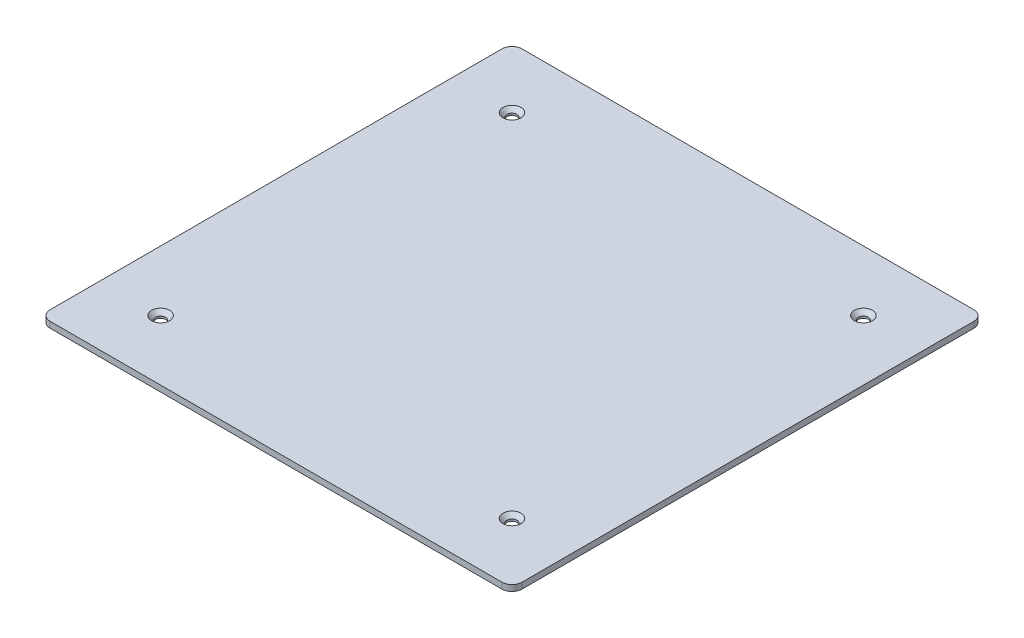
ISO-10303-21;
HEADER;
FILE_DESCRIPTION(('STEP AP214'),'2;1');
FILE_NAME('part.step','',(''),(''),'','','');
FILE_SCHEMA(('AUTOMOTIVE_DESIGN { 1 0 10303 214 1 1 1 1 }'));
ENDSEC;
DATA;
#1=APPLICATION_CONTEXT('core data for automotive mechanical design processes');
#2=APPLICATION_PROTOCOL_DEFINITION('international standard','automotive_design',2000,#1);
#3=PRODUCT_CONTEXT('',#1,'mechanical');
#4=PRODUCT('Part','Part','',(#3));
#5=PRODUCT_RELATED_PRODUCT_CATEGORY('part','',(#4));
#6=PRODUCT_DEFINITION_FORMATION('','',#4);
#7=PRODUCT_DEFINITION_CONTEXT('part definition',#1,'design');
#8=PRODUCT_DEFINITION('design','',#6,#7);
#9=PRODUCT_DEFINITION_SHAPE('','',#8);
#10=(LENGTH_UNIT() NAMED_UNIT(*) SI_UNIT(.MILLI.,.METRE.));
#11=(NAMED_UNIT(*) PLANE_ANGLE_UNIT() SI_UNIT($,.RADIAN.));
#12=(NAMED_UNIT(*) SI_UNIT($,.STERADIAN.) SOLID_ANGLE_UNIT());
#13=UNCERTAINTY_MEASURE_WITH_UNIT(LENGTH_MEASURE(1.E-05),#10,'distance_accuracy_value','');
#14=(GEOMETRIC_REPRESENTATION_CONTEXT(3) GLOBAL_UNCERTAINTY_ASSIGNED_CONTEXT((#13)) GLOBAL_UNIT_ASSIGNED_CONTEXT((#10,
#11,#12)) REPRESENTATION_CONTEXT('',''));
#15=CARTESIAN_POINT('',(0.,0.,0.));
#16=DIRECTION('',(0.,0.,1.));
#17=DIRECTION('',(1.,0.,0.));
#18=AXIS2_PLACEMENT_3D('',#15,#16,#17);
#19=CARTESIAN_POINT('',(112.5,3.,112.5));
#20=DIRECTION('',(0.,1.,0.));
#21=DIRECTION('',(0.,0.,1.));
#22=AXIS2_PLACEMENT_3D('',#19,#20,#21);
#23=PLANE('',#22);
#24=CARTESIAN_POINT('',(87.5,3.,-87.5));
#25=DIRECTION('',(0.,1.,0.));
#26=DIRECTION('',(0.,0.,1.));
#27=AXIS2_PLACEMENT_3D('',#24,#25,#26);
#28=CIRCLE('',#27,4.50000000000003);
#29=CARTESIAN_POINT('',(87.5,3.,-83.));
#30=VERTEX_POINT('',#29);
#31=EDGE_CURVE('E172',#30,#30,#28,.F.);
#32=ORIENTED_EDGE('',*,*,#31,.T.);
#33=EDGE_LOOP('',(#32));
#34=FACE_BOUND('',#33,.T.);
#35=CARTESIAN_POINT('',(87.5,3.,87.5));
#36=DIRECTION('',(0.,1.,0.));
#37=DIRECTION('',(0.,0.,1.));
#38=AXIS2_PLACEMENT_3D('',#35,#36,#37);
#39=CIRCLE('',#38,4.50000000000002);
#40=CARTESIAN_POINT('',(87.5,3.,92.));
#41=VERTEX_POINT('',#40);
#42=EDGE_CURVE('E169',#41,#41,#39,.F.);
#43=ORIENTED_EDGE('',*,*,#42,.T.);
#44=EDGE_LOOP('',(#43));
#45=FACE_BOUND('',#44,.T.);
#46=CARTESIAN_POINT('',(-87.5,3.,87.5));
#47=DIRECTION('',(0.,1.,0.));
#48=DIRECTION('',(0.,0.,1.));
#49=AXIS2_PLACEMENT_3D('',#46,#47,#48);
#50=CIRCLE('',#49,4.50000000000002);
#51=CARTESIAN_POINT('',(-87.5,3.,92.0000000000001));
#52=VERTEX_POINT('',#51);
#53=EDGE_CURVE('E166',#52,#52,#50,.F.);
#54=ORIENTED_EDGE('',*,*,#53,.T.);
#55=EDGE_LOOP('',(#54));
#56=FACE_BOUND('',#55,.T.);
#57=CARTESIAN_POINT('',(-87.5,3.,-87.5));
#58=DIRECTION('',(0.,1.,0.));
#59=DIRECTION('',(0.,0.,1.));
#60=AXIS2_PLACEMENT_3D('',#57,#58,#59);
#61=CIRCLE('',#60,4.50000000000003);
#62=CARTESIAN_POINT('',(-87.5,3.,-83.));
#63=VERTEX_POINT('',#62);
#64=EDGE_CURVE('E163',#63,#63,#61,.F.);
#65=ORIENTED_EDGE('',*,*,#64,.T.);
#66=EDGE_LOOP('',(#65));
#67=FACE_BOUND('',#66,.T.);
#68=CARTESIAN_POINT('',(112.5,3.,112.5));
#69=DIRECTION('',(0.,1.,0.));
#70=DIRECTION('',(0.,0.,1.));
#71=AXIS2_PLACEMENT_3D('',#68,#69,#70);
#72=CIRCLE('',#71,5.);
#73=CARTESIAN_POINT('',(112.5,3.,117.5));
#74=VERTEX_POINT('',#73);
#75=CARTESIAN_POINT('',(117.5,3.,112.5));
#76=VERTEX_POINT('',#75);
#77=EDGE_CURVE('E145',#74,#76,#72,.T.);
#78=ORIENTED_EDGE('',*,*,#77,.T.);
#79=DIRECTION('',(0.,0.,-1.));
#80=VECTOR('',#79,1.);
#81=CARTESIAN_POINT('',(117.5,3.,112.5));
#82=LINE('',#81,#80);
#83=CARTESIAN_POINT('',(117.5,3.,-112.5));
#84=VERTEX_POINT('',#83);
#85=EDGE_CURVE('E94',#76,#84,#82,.T.);
#86=ORIENTED_EDGE('',*,*,#85,.T.);
#87=CARTESIAN_POINT('',(112.5,3.,-112.5));
#88=DIRECTION('',(0.,1.,0.));
#89=DIRECTION('',(0.,0.,1.));
#90=AXIS2_PLACEMENT_3D('',#87,#88,#89);
#91=CIRCLE('',#90,5.);
#92=CARTESIAN_POINT('',(112.5,3.,-117.5));
#93=VERTEX_POINT('',#92);
#94=EDGE_CURVE('E268',#84,#93,#91,.T.);
#95=ORIENTED_EDGE('',*,*,#94,.T.);
#96=DIRECTION('',(-1.,0.,0.));
#97=VECTOR('',#96,1.);
#98=CARTESIAN_POINT('',(112.5,3.,-117.5));
#99=LINE('',#98,#97);
#100=CARTESIAN_POINT('',(-112.5,3.,-117.5));
#101=VERTEX_POINT('',#100);
#102=EDGE_CURVE('E270',#93,#101,#99,.T.);
#103=ORIENTED_EDGE('',*,*,#102,.T.);
#104=CARTESIAN_POINT('',(-112.5,3.,-112.5));
#105=DIRECTION('',(0.,1.,0.));
#106=DIRECTION('',(0.,0.,1.));
#107=AXIS2_PLACEMENT_3D('',#104,#105,#106);
#108=CIRCLE('',#107,5.);
#109=CARTESIAN_POINT('',(-117.5,3.,-112.5));
#110=VERTEX_POINT('',#109);
#111=EDGE_CURVE('E112',#101,#110,#108,.T.);
#112=ORIENTED_EDGE('',*,*,#111,.T.);
#113=DIRECTION('',(0.,0.,1.));
#114=VECTOR('',#113,1.);
#115=CARTESIAN_POINT('',(-117.5,3.,112.5));
#116=LINE('',#115,#114);
#117=CARTESIAN_POINT('',(-117.5,3.,112.5));
#118=VERTEX_POINT('',#117);
#119=EDGE_CURVE('E107',#110,#118,#116,.T.);
#120=ORIENTED_EDGE('',*,*,#119,.T.);
#121=CARTESIAN_POINT('',(-112.5,3.,112.5));
#122=DIRECTION('',(0.,1.,0.));
#123=DIRECTION('',(0.,0.,-1.));
#124=AXIS2_PLACEMENT_3D('',#121,#122,#123);
#125=CIRCLE('',#124,5.);
#126=CARTESIAN_POINT('',(-112.5,3.,117.5));
#127=VERTEX_POINT('',#126);
#128=EDGE_CURVE('E110',#118,#127,#125,.T.);
#129=ORIENTED_EDGE('',*,*,#128,.T.);
#130=DIRECTION('',(1.,0.,0.));
#131=VECTOR('',#130,1.);
#132=CARTESIAN_POINT('',(112.5,3.,117.5));
#133=LINE('',#132,#131);
#134=EDGE_CURVE('E50',#127,#74,#133,.T.);
#135=ORIENTED_EDGE('',*,*,#134,.T.);
#136=EDGE_LOOP('',(#78,#86,#95,#103,#112,#120,#129,#135));
#137=FACE_BOUND('',#136,.T.);
#138=ADVANCED_FACE('F33',(#34,#45,#56,#67,#137),#23,.T.);
#139=CARTESIAN_POINT('',(112.5,0.,112.5));
#140=DIRECTION('',(0.,1.,0.));
#141=DIRECTION('',(0.,0.,1.));
#142=AXIS2_PLACEMENT_3D('',#139,#140,#141);
#143=PLANE('',#142);
#144=CARTESIAN_POINT('',(112.5,0.,112.5));
#145=DIRECTION('',(0.,1.,0.));
#146=DIRECTION('',(0.,0.,1.));
#147=AXIS2_PLACEMENT_3D('',#144,#145,#146);
#148=CIRCLE('',#147,5.);
#149=CARTESIAN_POINT('',(112.5,0.,117.5));
#150=VERTEX_POINT('',#149);
#151=CARTESIAN_POINT('',(117.5,0.,112.5));
#152=VERTEX_POINT('',#151);
#153=EDGE_CURVE('E130',#150,#152,#148,.T.);
#154=ORIENTED_EDGE('',*,*,#153,.F.);
#155=DIRECTION('',(1.,0.,0.));
#156=VECTOR('',#155,1.);
#157=CARTESIAN_POINT('',(112.5,0.,117.5));
#158=LINE('',#157,#156);
#159=CARTESIAN_POINT('',(-112.5,0.,117.5));
#160=VERTEX_POINT('',#159);
#161=EDGE_CURVE('E85',#160,#150,#158,.T.);
#162=ORIENTED_EDGE('',*,*,#161,.F.);
#163=CARTESIAN_POINT('',(-112.5,0.,112.5));
#164=DIRECTION('',(0.,1.,0.));
#165=DIRECTION('',(0.,0.,-1.));
#166=AXIS2_PLACEMENT_3D('',#163,#164,#165);
#167=CIRCLE('',#166,5.);
#168=CARTESIAN_POINT('',(-117.5,0.,112.5));
#169=VERTEX_POINT('',#168);
#170=EDGE_CURVE('E79',#169,#160,#167,.T.);
#171=ORIENTED_EDGE('',*,*,#170,.F.);
#172=DIRECTION('',(0.,0.,1.));
#173=VECTOR('',#172,1.);
#174=CARTESIAN_POINT('',(-117.5,0.,112.5));
#175=LINE('',#174,#173);
#176=CARTESIAN_POINT('',(-117.5,0.,-112.5));
#177=VERTEX_POINT('',#176);
#178=EDGE_CURVE('E120',#177,#169,#175,.T.);
#179=ORIENTED_EDGE('',*,*,#178,.F.);
#180=CARTESIAN_POINT('',(-112.5,0.,-112.5));
#181=DIRECTION('',(0.,1.,0.));
#182=DIRECTION('',(0.,0.,1.));
#183=AXIS2_PLACEMENT_3D('',#180,#181,#182);
#184=CIRCLE('',#183,5.);
#185=CARTESIAN_POINT('',(-112.5,0.,-117.5));
#186=VERTEX_POINT('',#185);
#187=EDGE_CURVE('E140',#186,#177,#184,.T.);
#188=ORIENTED_EDGE('',*,*,#187,.F.);
#189=DIRECTION('',(-1.,0.,0.));
#190=VECTOR('',#189,1.);
#191=CARTESIAN_POINT('',(112.5,0.,-117.5));
#192=LINE('',#191,#190);
#193=CARTESIAN_POINT('',(112.5,0.,-117.5));
#194=VERTEX_POINT('',#193);
#195=EDGE_CURVE('E138',#194,#186,#192,.T.);
#196=ORIENTED_EDGE('',*,*,#195,.F.);
#197=CARTESIAN_POINT('',(112.5,0.,-112.5));
#198=DIRECTION('',(0.,1.,0.));
#199=DIRECTION('',(0.,0.,1.));
#200=AXIS2_PLACEMENT_3D('',#197,#198,#199);
#201=CIRCLE('',#200,5.);
#202=CARTESIAN_POINT('',(117.5,0.,-112.5));
#203=VERTEX_POINT('',#202);
#204=EDGE_CURVE('E136',#203,#194,#201,.T.);
#205=ORIENTED_EDGE('',*,*,#204,.F.);
#206=DIRECTION('',(0.,0.,-1.));
#207=VECTOR('',#206,1.);
#208=CARTESIAN_POINT('',(117.5,0.,112.5));
#209=LINE('',#208,#207);
#210=EDGE_CURVE('E133',#152,#203,#209,.T.);
#211=ORIENTED_EDGE('',*,*,#210,.F.);
#212=EDGE_LOOP('',(#154,#162,#171,#179,#188,#196,#205,#211));
#213=FACE_BOUND('',#212,.T.);
#214=CARTESIAN_POINT('',(-87.5,0.,-87.5));
#215=DIRECTION('',(0.,1.,0.));
#216=DIRECTION('',(0.,0.,1.));
#217=AXIS2_PLACEMENT_3D('',#214,#215,#216);
#218=CIRCLE('',#217,2.5);
#219=CARTESIAN_POINT('',(-87.5,0.,-85.));
#220=VERTEX_POINT('',#219);
#221=EDGE_CURVE('E134',#220,#220,#218,.T.);
#222=ORIENTED_EDGE('',*,*,#221,.T.);
#223=EDGE_LOOP('',(#222));
#224=FACE_BOUND('',#223,.T.);
#225=CARTESIAN_POINT('',(-87.5,0.,87.5));
#226=DIRECTION('',(0.,1.,0.));
#227=DIRECTION('',(0.,0.,1.));
#228=AXIS2_PLACEMENT_3D('',#225,#226,#227);
#229=CIRCLE('',#228,2.5);
#230=CARTESIAN_POINT('',(-87.5,0.,90.));
#231=VERTEX_POINT('',#230);
#232=EDGE_CURVE('E259',#231,#231,#229,.T.);
#233=ORIENTED_EDGE('',*,*,#232,.T.);
#234=EDGE_LOOP('',(#233));
#235=FACE_BOUND('',#234,.T.);
#236=CARTESIAN_POINT('',(87.5,0.,87.5));
#237=DIRECTION('',(0.,1.,0.));
#238=DIRECTION('',(0.,0.,1.));
#239=AXIS2_PLACEMENT_3D('',#236,#237,#238);
#240=CIRCLE('',#239,2.5);
#241=CARTESIAN_POINT('',(87.5,0.,90.));
#242=VERTEX_POINT('',#241);
#243=EDGE_CURVE('E256',#242,#242,#240,.T.);
#244=ORIENTED_EDGE('',*,*,#243,.T.);
#245=EDGE_LOOP('',(#244));
#246=FACE_BOUND('',#245,.T.);
#247=CARTESIAN_POINT('',(87.5,0.,-87.5));
#248=DIRECTION('',(0.,1.,0.));
#249=DIRECTION('',(0.,0.,1.));
#250=AXIS2_PLACEMENT_3D('',#247,#248,#249);
#251=CIRCLE('',#250,2.5);
#252=CARTESIAN_POINT('',(87.5,0.,-85.));
#253=VERTEX_POINT('',#252);
#254=EDGE_CURVE('E254',#253,#253,#251,.T.);
#255=ORIENTED_EDGE('',*,*,#254,.T.);
#256=EDGE_LOOP('',(#255));
#257=FACE_BOUND('',#256,.T.);
#258=ADVANCED_FACE('F197',(#213,#224,#235,#246,#257),#143,.F.);
#259=CARTESIAN_POINT('',(112.5,3.,112.5));
#260=DIRECTION('',(0.,-1.,0.));
#261=DIRECTION('',(0.,0.,-1.));
#262=AXIS2_PLACEMENT_3D('',#259,#260,#261);
#263=CYLINDRICAL_SURFACE('',#262,5.);
#264=ORIENTED_EDGE('',*,*,#153,.T.);
#265=DIRECTION('',(0.,-1.,0.));
#266=VECTOR('',#265,1.);
#267=CARTESIAN_POINT('',(117.5,3.,112.5));
#268=LINE('',#267,#266);
#269=EDGE_CURVE('E158',#76,#152,#268,.T.);
#270=ORIENTED_EDGE('',*,*,#269,.F.);
#271=ORIENTED_EDGE('',*,*,#77,.F.);
#272=DIRECTION('',(0.,-1.,0.));
#273=VECTOR('',#272,1.);
#274=CARTESIAN_POINT('',(112.5,3.,117.5));
#275=LINE('',#274,#273);
#276=EDGE_CURVE('E126',#74,#150,#275,.T.);
#277=ORIENTED_EDGE('',*,*,#276,.T.);
#278=EDGE_LOOP('',(#264,#270,#271,#277));
#279=FACE_BOUND('',#278,.T.);
#280=ADVANCED_FACE('F205',(#279),#263,.T.);
#281=CARTESIAN_POINT('',(117.5,3.,112.5));
#282=DIRECTION('',(-1.,0.,0.));
#283=DIRECTION('',(0.,0.,1.));
#284=AXIS2_PLACEMENT_3D('',#281,#282,#283);
#285=PLANE('',#284);
#286=ORIENTED_EDGE('',*,*,#210,.T.);
#287=DIRECTION('',(0.,-1.,0.));
#288=VECTOR('',#287,1.);
#289=CARTESIAN_POINT('',(117.5,3.,-112.5));
#290=LINE('',#289,#288);
#291=EDGE_CURVE('E155',#84,#203,#290,.T.);
#292=ORIENTED_EDGE('',*,*,#291,.F.);
#293=ORIENTED_EDGE('',*,*,#85,.F.);
#294=ORIENTED_EDGE('',*,*,#269,.T.);
#295=EDGE_LOOP('',(#286,#292,#293,#294));
#296=FACE_BOUND('',#295,.T.);
#297=ADVANCED_FACE('F231',(#296),#285,.F.);
#298=CARTESIAN_POINT('',(112.5,3.,-112.5));
#299=DIRECTION('',(0.,-1.,0.));
#300=DIRECTION('',(0.,0.,-1.));
#301=AXIS2_PLACEMENT_3D('',#298,#299,#300);
#302=CYLINDRICAL_SURFACE('',#301,5.);
#303=ORIENTED_EDGE('',*,*,#204,.T.);
#304=DIRECTION('',(0.,-1.,0.));
#305=VECTOR('',#304,1.);
#306=CARTESIAN_POINT('',(112.5,3.,-117.5));
#307=LINE('',#306,#305);
#308=EDGE_CURVE('E152',#93,#194,#307,.T.);
#309=ORIENTED_EDGE('',*,*,#308,.F.);
#310=ORIENTED_EDGE('',*,*,#94,.F.);
#311=ORIENTED_EDGE('',*,*,#291,.T.);
#312=EDGE_LOOP('',(#303,#309,#310,#311));
#313=FACE_BOUND('',#312,.T.);
#314=ADVANCED_FACE('F227',(#313),#302,.T.);
#315=CARTESIAN_POINT('',(112.5,3.,-117.5));
#316=DIRECTION('',(0.,0.,1.));
#317=DIRECTION('',(1.,0.,0.));
#318=AXIS2_PLACEMENT_3D('',#315,#316,#317);
#319=PLANE('',#318);
#320=ORIENTED_EDGE('',*,*,#195,.T.);
#321=DIRECTION('',(0.,-1.,0.));
#322=VECTOR('',#321,1.);
#323=CARTESIAN_POINT('',(-112.5,3.,-117.5));
#324=LINE('',#323,#322);
#325=EDGE_CURVE('E149',#101,#186,#324,.T.);
#326=ORIENTED_EDGE('',*,*,#325,.F.);
#327=ORIENTED_EDGE('',*,*,#102,.F.);
#328=ORIENTED_EDGE('',*,*,#308,.T.);
#329=EDGE_LOOP('',(#320,#326,#327,#328));
#330=FACE_BOUND('',#329,.T.);
#331=ADVANCED_FACE('F223',(#330),#319,.F.);
#332=CARTESIAN_POINT('',(-112.5,3.,-112.5));
#333=DIRECTION('',(0.,-1.,0.));
#334=DIRECTION('',(0.,0.,-1.));
#335=AXIS2_PLACEMENT_3D('',#332,#333,#334);
#336=CYLINDRICAL_SURFACE('',#335,5.);
#337=ORIENTED_EDGE('',*,*,#187,.T.);
#338=DIRECTION('',(0.,-1.,0.));
#339=VECTOR('',#338,1.);
#340=CARTESIAN_POINT('',(-117.5,3.,-112.5));
#341=LINE('',#340,#339);
#342=EDGE_CURVE('E121',#110,#177,#341,.T.);
#343=ORIENTED_EDGE('',*,*,#342,.F.);
#344=ORIENTED_EDGE('',*,*,#111,.F.);
#345=ORIENTED_EDGE('',*,*,#325,.T.);
#346=EDGE_LOOP('',(#337,#343,#344,#345));
#347=FACE_BOUND('',#346,.T.);
#348=ADVANCED_FACE('F220',(#347),#336,.T.);
#349=CARTESIAN_POINT('',(-117.5,3.,112.5));
#350=DIRECTION('',(1.,0.,0.));
#351=DIRECTION('',(0.,0.,-1.));
#352=AXIS2_PLACEMENT_3D('',#349,#350,#351);
#353=PLANE('',#352);
#354=ORIENTED_EDGE('',*,*,#178,.T.);
#355=DIRECTION('',(0.,-1.,0.));
#356=VECTOR('',#355,1.);
#357=CARTESIAN_POINT('',(-117.5,3.,112.5));
#358=LINE('',#357,#356);
#359=EDGE_CURVE('E117',#118,#169,#358,.T.);
#360=ORIENTED_EDGE('',*,*,#359,.F.);
#361=ORIENTED_EDGE('',*,*,#119,.F.);
#362=ORIENTED_EDGE('',*,*,#342,.T.);
#363=EDGE_LOOP('',(#354,#360,#361,#362));
#364=FACE_BOUND('',#363,.T.);
#365=ADVANCED_FACE('F118',(#364),#353,.F.);
#366=CARTESIAN_POINT('',(-112.5,3.,112.5));
#367=DIRECTION('',(0.,-1.,0.));
#368=DIRECTION('',(0.,0.,-1.));
#369=AXIS2_PLACEMENT_3D('',#366,#367,#368);
#370=CYLINDRICAL_SURFACE('',#369,5.);
#371=ORIENTED_EDGE('',*,*,#170,.T.);
#372=DIRECTION('',(0.,-1.,0.));
#373=VECTOR('',#372,1.);
#374=CARTESIAN_POINT('',(-112.5,3.,117.5));
#375=LINE('',#374,#373);
#376=EDGE_CURVE('E122',#127,#160,#375,.T.);
#377=ORIENTED_EDGE('',*,*,#376,.F.);
#378=ORIENTED_EDGE('',*,*,#128,.F.);
#379=ORIENTED_EDGE('',*,*,#359,.T.);
#380=EDGE_LOOP('',(#371,#377,#378,#379));
#381=FACE_BOUND('',#380,.T.);
#382=ADVANCED_FACE('F124',(#381),#370,.T.);
#383=CARTESIAN_POINT('',(112.5,3.,117.5));
#384=DIRECTION('',(0.,0.,-1.));
#385=DIRECTION('',(-1.,0.,0.));
#386=AXIS2_PLACEMENT_3D('',#383,#384,#385);
#387=PLANE('',#386);
#388=ORIENTED_EDGE('',*,*,#161,.T.);
#389=ORIENTED_EDGE('',*,*,#276,.F.);
#390=ORIENTED_EDGE('',*,*,#134,.F.);
#391=ORIENTED_EDGE('',*,*,#376,.T.);
#392=EDGE_LOOP('',(#388,#389,#390,#391));
#393=FACE_BOUND('',#392,.T.);
#394=ADVANCED_FACE('F213',(#393),#387,.F.);
#395=CARTESIAN_POINT('',(-87.5,3.,-87.5));
#396=DIRECTION('',(0.,-1.,0.));
#397=DIRECTION('',(0.,0.,-1.));
#398=AXIS2_PLACEMENT_3D('',#395,#396,#397);
#399=CYLINDRICAL_SURFACE('',#398,2.5);
#400=CARTESIAN_POINT('',(-87.5,0.999999999999983,-87.5));
#401=DIRECTION('',(0.,1.,0.));
#402=DIRECTION('',(0.,0.,1.));
#403=AXIS2_PLACEMENT_3D('',#400,#401,#402);
#404=CIRCLE('',#403,2.5);
#405=CARTESIAN_POINT('',(-87.5,0.999999999999983,-85.));
#406=VERTEX_POINT('',#405);
#407=EDGE_CURVE('E11',#406,#406,#404,.T.);
#408=ORIENTED_EDGE('',*,*,#407,.T.);
#409=EDGE_LOOP('',(#408));
#410=FACE_BOUND('',#409,.T.);
#411=ORIENTED_EDGE('',*,*,#221,.F.);
#412=EDGE_LOOP('',(#411));
#413=FACE_BOUND('',#412,.T.);
#414=ADVANCED_FACE('F210',(#410,#413),#399,.F.);
#415=CARTESIAN_POINT('',(-87.5,3.,87.5));
#416=DIRECTION('',(0.,-1.,0.));
#417=DIRECTION('',(0.,0.,-1.));
#418=AXIS2_PLACEMENT_3D('',#415,#416,#417);
#419=CYLINDRICAL_SURFACE('',#418,2.5);
#420=CARTESIAN_POINT('',(-87.5,0.999999999999983,87.5));
#421=DIRECTION('',(0.,1.,0.));
#422=DIRECTION('',(0.,0.,1.));
#423=AXIS2_PLACEMENT_3D('',#420,#421,#422);
#424=CIRCLE('',#423,2.5);
#425=CARTESIAN_POINT('',(-87.5,0.999999999999983,90.));
#426=VERTEX_POINT('',#425);
#427=EDGE_CURVE('E42',#426,#426,#424,.T.);
#428=ORIENTED_EDGE('',*,*,#427,.T.);
#429=EDGE_LOOP('',(#428));
#430=FACE_BOUND('',#429,.T.);
#431=ORIENTED_EDGE('',*,*,#232,.F.);
#432=EDGE_LOOP('',(#431));
#433=FACE_BOUND('',#432,.T.);
#434=ADVANCED_FACE('F180',(#430,#433),#419,.F.);
#435=CARTESIAN_POINT('',(87.5,3.,87.5));
#436=DIRECTION('',(0.,-1.,0.));
#437=DIRECTION('',(0.,0.,-1.));
#438=AXIS2_PLACEMENT_3D('',#435,#436,#437);
#439=CYLINDRICAL_SURFACE('',#438,2.5);
#440=CARTESIAN_POINT('',(87.5,0.999999999999983,87.5));
#441=DIRECTION('',(0.,1.,0.));
#442=DIRECTION('',(0.,0.,1.));
#443=AXIS2_PLACEMENT_3D('',#440,#441,#442);
#444=CIRCLE('',#443,2.5);
#445=CARTESIAN_POINT('',(87.5,0.999999999999983,90.));
#446=VERTEX_POINT('',#445);
#447=EDGE_CURVE('E175',#446,#446,#444,.T.);
#448=ORIENTED_EDGE('',*,*,#447,.T.);
#449=EDGE_LOOP('',(#448));
#450=FACE_BOUND('',#449,.T.);
#451=ORIENTED_EDGE('',*,*,#243,.F.);
#452=EDGE_LOOP('',(#451));
#453=FACE_BOUND('',#452,.T.);
#454=ADVANCED_FACE('F245',(#450,#453),#439,.F.);
#455=CARTESIAN_POINT('',(87.5,3.,-87.5));
#456=DIRECTION('',(0.,-1.,0.));
#457=DIRECTION('',(0.,0.,-1.));
#458=AXIS2_PLACEMENT_3D('',#455,#456,#457);
#459=CYLINDRICAL_SURFACE('',#458,2.5);
#460=CARTESIAN_POINT('',(87.5,0.999999999999983,-87.5));
#461=DIRECTION('',(0.,1.,0.));
#462=DIRECTION('',(0.,0.,1.));
#463=AXIS2_PLACEMENT_3D('',#460,#461,#462);
#464=CIRCLE('',#463,2.5);
#465=CARTESIAN_POINT('',(87.5,0.999999999999983,-85.));
#466=VERTEX_POINT('',#465);
#467=EDGE_CURVE('E160',#466,#466,#464,.T.);
#468=ORIENTED_EDGE('',*,*,#467,.T.);
#469=EDGE_LOOP('',(#468));
#470=FACE_BOUND('',#469,.T.);
#471=ORIENTED_EDGE('',*,*,#254,.F.);
#472=EDGE_LOOP('',(#471));
#473=FACE_BOUND('',#472,.T.);
#474=ADVANCED_FACE('F239',(#470,#473),#459,.F.);
#475=CARTESIAN_POINT('',(87.5,0.999999999999983,-87.5));
#476=DIRECTION('',(0.,1.,0.));
#477=DIRECTION('',(0.,0.,1.));
#478=AXIS2_PLACEMENT_3D('',#475,#476,#477);
#479=CONICAL_SURFACE('',#478,2.5,0.785398163397453);
#480=ORIENTED_EDGE('',*,*,#31,.F.);
#481=EDGE_LOOP('',(#480));
#482=FACE_BOUND('',#481,.T.);
#483=ORIENTED_EDGE('',*,*,#467,.F.);
#484=EDGE_LOOP('',(#483));
#485=FACE_BOUND('',#484,.T.);
#486=ADVANCED_FACE('F192',(#482,#485),#479,.F.);
#487=CARTESIAN_POINT('',(87.5,0.999999999999983,87.5));
#488=DIRECTION('',(0.,1.,0.));
#489=DIRECTION('',(0.,0.,1.));
#490=AXIS2_PLACEMENT_3D('',#487,#488,#489);
#491=CONICAL_SURFACE('',#490,2.5,0.78539816339745);
#492=ORIENTED_EDGE('',*,*,#42,.F.);
#493=EDGE_LOOP('',(#492));
#494=FACE_BOUND('',#493,.T.);
#495=ORIENTED_EDGE('',*,*,#447,.F.);
#496=EDGE_LOOP('',(#495));
#497=FACE_BOUND('',#496,.T.);
#498=ADVANCED_FACE('F185',(#494,#497),#491,.F.);
#499=CARTESIAN_POINT('',(-87.5,0.999999999999983,87.5));
#500=DIRECTION('',(0.,1.,0.));
#501=DIRECTION('',(0.,0.,1.));
#502=AXIS2_PLACEMENT_3D('',#499,#500,#501);
#503=CONICAL_SURFACE('',#502,2.5,0.78539816339745);
#504=ORIENTED_EDGE('',*,*,#53,.F.);
#505=EDGE_LOOP('',(#504));
#506=FACE_BOUND('',#505,.T.);
#507=ORIENTED_EDGE('',*,*,#427,.F.);
#508=EDGE_LOOP('',(#507));
#509=FACE_BOUND('',#508,.T.);
#510=ADVANCED_FACE('F183',(#506,#509),#503,.F.);
#511=CARTESIAN_POINT('',(-87.5,0.999999999999983,-87.5));
#512=DIRECTION('',(0.,1.,0.));
#513=DIRECTION('',(0.,0.,1.));
#514=AXIS2_PLACEMENT_3D('',#511,#512,#513);
#515=CONICAL_SURFACE('',#514,2.5,0.785398163397453);
#516=ORIENTED_EDGE('',*,*,#64,.F.);
#517=EDGE_LOOP('',(#516));
#518=FACE_BOUND('',#517,.T.);
#519=ORIENTED_EDGE('',*,*,#407,.F.);
#520=EDGE_LOOP('',(#519));
#521=FACE_BOUND('',#520,.T.);
#522=ADVANCED_FACE('F35',(#518,#521),#515,.F.);
#523=CLOSED_SHELL('',(#138,#258,#280,#297,#314,#331,#348,#365,#382,#394,#414,#434,#454,#474,
#486,#498,#510,#522));
#524=MANIFOLD_SOLID_BREP('B2',#523);
#525=ADVANCED_BREP_SHAPE_REPRESENTATION('',(#18,#524),#14);
#526=SHAPE_DEFINITION_REPRESENTATION(#9,#525);
ENDSEC;
END-ISO-10303-21;
